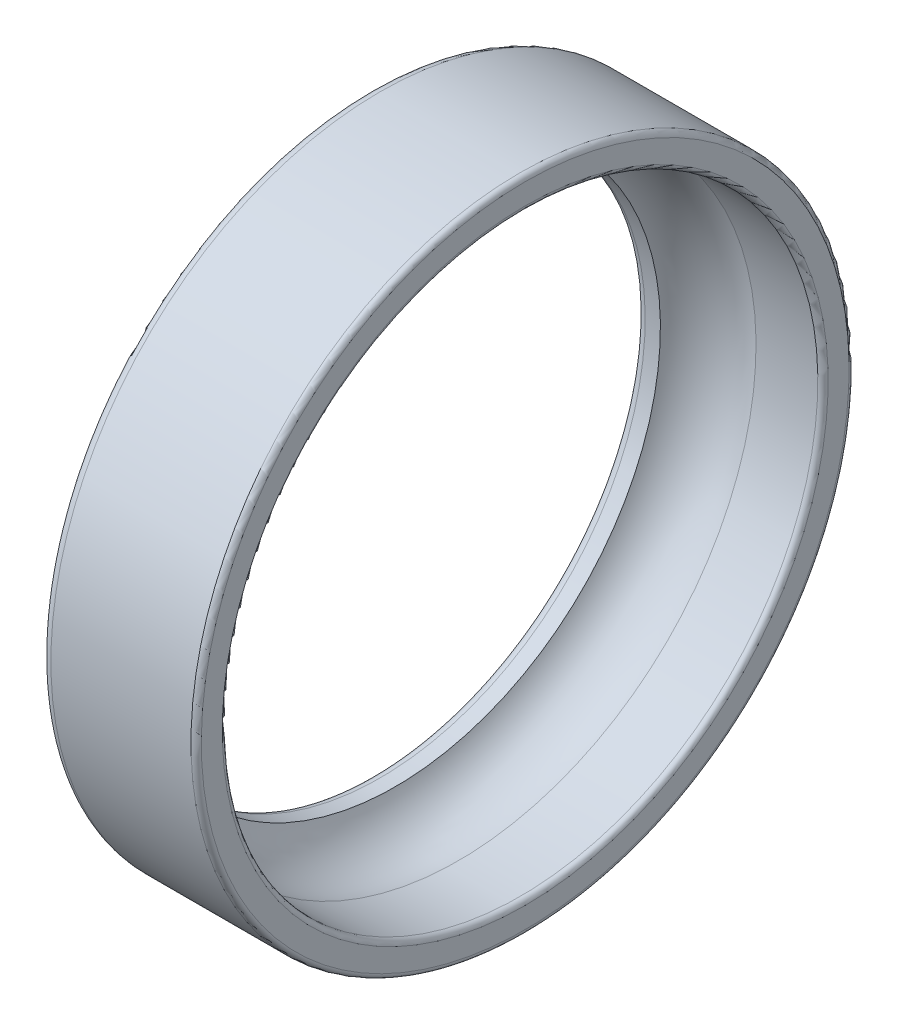
ISO-10303-21;
HEADER;
FILE_DESCRIPTION(('STEP AP214'),'2;1');
FILE_NAME('part.step','',(''),(''),'','','');
FILE_SCHEMA(('AUTOMOTIVE_DESIGN { 1 0 10303 214 1 1 1 1 }'));
ENDSEC;
DATA;
#1=APPLICATION_CONTEXT('core data for automotive mechanical design processes');
#2=APPLICATION_PROTOCOL_DEFINITION('international standard','automotive_design',2000,#1);
#3=PRODUCT_CONTEXT('',#1,'mechanical');
#4=PRODUCT('Part','Part','',(#3));
#5=PRODUCT_RELATED_PRODUCT_CATEGORY('part','',(#4));
#6=PRODUCT_DEFINITION_FORMATION('','',#4);
#7=PRODUCT_DEFINITION_CONTEXT('part definition',#1,'design');
#8=PRODUCT_DEFINITION('design','',#6,#7);
#9=PRODUCT_DEFINITION_SHAPE('','',#8);
#10=(LENGTH_UNIT() NAMED_UNIT(*) SI_UNIT(.MILLI.,.METRE.));
#11=(NAMED_UNIT(*) PLANE_ANGLE_UNIT() SI_UNIT($,.RADIAN.));
#12=(NAMED_UNIT(*) SI_UNIT($,.STERADIAN.) SOLID_ANGLE_UNIT());
#13=UNCERTAINTY_MEASURE_WITH_UNIT(LENGTH_MEASURE(1.E-05),#10,'distance_accuracy_value','');
#14=(GEOMETRIC_REPRESENTATION_CONTEXT(3) GLOBAL_UNCERTAINTY_ASSIGNED_CONTEXT((#13)) GLOBAL_UNIT_ASSIGNED_CONTEXT((#10,
#11,#12)) REPRESENTATION_CONTEXT('',''));
#15=CARTESIAN_POINT('',(0.,0.,0.));
#16=DIRECTION('',(0.,0.,1.));
#17=DIRECTION('',(1.,0.,0.));
#18=AXIS2_PLACEMENT_3D('',#15,#16,#17);
#19=CARTESIAN_POINT('',(3.71915812802405,0.,0.));
#20=DIRECTION('',(-1.,0.,0.));
#21=DIRECTION('',(0.,1.,0.));
#22=AXIS2_PLACEMENT_3D('',#19,#20,#21);
#23=CYLINDRICAL_SURFACE('',#22,56.425);
#24=CARTESIAN_POINT('',(5.3383162560481,0.,0.));
#25=DIRECTION('',(1.,0.,0.));
#26=DIRECTION('',(0.,1.,0.));
#27=AXIS2_PLACEMENT_3D('',#24,#25,#26);
#28=CIRCLE('',#27,56.425);
#29=CARTESIAN_POINT('',(5.3383162560481,56.425,0.));
#30=VERTEX_POINT('',#29);
#31=EDGE_CURVE('E11',#30,#30,#28,.T.);
#32=ORIENTED_EDGE('',*,*,#31,.T.);
#33=EDGE_LOOP('',(#32));
#34=FACE_BOUND('',#33,.T.);
#35=CARTESIAN_POINT('',(2.1,0.,0.));
#36=DIRECTION('',(1.,0.,0.));
#37=DIRECTION('',(0.,1.,0.));
#38=AXIS2_PLACEMENT_3D('',#35,#36,#37);
#39=CIRCLE('',#38,56.425);
#40=CARTESIAN_POINT('',(2.1,56.425,0.));
#41=VERTEX_POINT('',#40);
#42=EDGE_CURVE('E65',#41,#41,#39,.T.);
#43=ORIENTED_EDGE('',*,*,#42,.F.);
#44=EDGE_LOOP('',(#43));
#45=FACE_BOUND('',#44,.T.);
#46=ADVANCED_FACE('F19',(#34,#45),#23,.F.);
#47=CARTESIAN_POINT('',(16.5,0.,0.));
#48=DIRECTION('',(1.,0.,0.));
#49=DIRECTION('',(0.,0.,-1.));
#50=AXIS2_PLACEMENT_3D('',#47,#48,#49);
#51=TOROIDAL_SURFACE('',#50,51.25,12.303);
#52=CARTESIAN_POINT('',(18.7527281238535,0.,0.));
#53=DIRECTION('',(1.,0.,0.));
#54=DIRECTION('',(0.,1.,0.));
#55=AXIS2_PLACEMENT_3D('',#52,#53,#54);
#56=CIRCLE('',#55,63.345);
#57=CARTESIAN_POINT('',(18.7527281238535,63.345,0.));
#58=VERTEX_POINT('',#57);
#59=EDGE_CURVE('E29',#58,#58,#56,.T.);
#60=ORIENTED_EDGE('',*,*,#59,.T.);
#61=EDGE_LOOP('',(#60));
#62=FACE_BOUND('',#61,.T.);
#63=ORIENTED_EDGE('',*,*,#31,.F.);
#64=EDGE_LOOP('',(#63));
#65=FACE_BOUND('',#64,.T.);
#66=ADVANCED_FACE('F101',(#62,#65),#51,.F.);
#67=CARTESIAN_POINT('',(25.3263640619267,0.,0.));
#68=DIRECTION('',(-1.,0.,0.));
#69=DIRECTION('',(0.,1.,0.));
#70=AXIS2_PLACEMENT_3D('',#67,#68,#69);
#71=CYLINDRICAL_SURFACE('',#70,63.345);
#72=CARTESIAN_POINT('',(31.9,0.,0.));
#73=DIRECTION('',(1.,0.,0.));
#74=DIRECTION('',(0.,1.,0.));
#75=AXIS2_PLACEMENT_3D('',#72,#73,#74);
#76=CIRCLE('',#75,63.345);
#77=CARTESIAN_POINT('',(31.9,63.345,0.));
#78=VERTEX_POINT('',#77);
#79=EDGE_CURVE('E79',#78,#78,#76,.T.);
#80=ORIENTED_EDGE('',*,*,#79,.T.);
#81=EDGE_LOOP('',(#80));
#82=FACE_BOUND('',#81,.T.);
#83=ORIENTED_EDGE('',*,*,#59,.F.);
#84=EDGE_LOOP('',(#83));
#85=FACE_BOUND('',#84,.T.);
#86=ADVANCED_FACE('F97',(#82,#85),#71,.F.);
#87=CARTESIAN_POINT('',(31.9,0.,0.));
#88=DIRECTION('',(1.,0.,0.));
#89=DIRECTION('',(0.,0.,-1.));
#90=AXIS2_PLACEMENT_3D('',#87,#88,#89);
#91=TOROIDAL_SURFACE('',#90,64.445,1.1);
#92=CARTESIAN_POINT('',(33.,0.,0.));
#93=DIRECTION('',(1.,0.,0.));
#94=DIRECTION('',(0.,1.,0.));
#95=AXIS2_PLACEMENT_3D('',#92,#93,#94);
#96=CIRCLE('',#95,64.445);
#97=CARTESIAN_POINT('',(33.,64.445,0.));
#98=VERTEX_POINT('',#97);
#99=EDGE_CURVE('E76',#98,#98,#96,.T.);
#100=ORIENTED_EDGE('',*,*,#99,.T.);
#101=EDGE_LOOP('',(#100));
#102=FACE_BOUND('',#101,.T.);
#103=ORIENTED_EDGE('',*,*,#79,.F.);
#104=EDGE_LOOP('',(#103));
#105=FACE_BOUND('',#104,.T.);
#106=ADVANCED_FACE('F84',(#102,#105),#91,.T.);
#107=CARTESIAN_POINT('',(33.,66.6725,0.));
#108=DIRECTION('',(1.,0.,0.));
#109=DIRECTION('',(0.,1.,0.));
#110=AXIS2_PLACEMENT_3D('',#107,#108,#109);
#111=PLANE('',#110);
#112=CARTESIAN_POINT('',(33.,0.,0.));
#113=DIRECTION('',(1.,0.,0.));
#114=DIRECTION('',(0.,1.,0.));
#115=AXIS2_PLACEMENT_3D('',#112,#113,#114);
#116=CIRCLE('',#115,68.9);
#117=CARTESIAN_POINT('',(33.,68.9,0.));
#118=VERTEX_POINT('',#117);
#119=EDGE_CURVE('E23',#118,#118,#116,.T.);
#120=ORIENTED_EDGE('',*,*,#119,.T.);
#121=EDGE_LOOP('',(#120));
#122=FACE_BOUND('',#121,.T.);
#123=ORIENTED_EDGE('',*,*,#99,.F.);
#124=EDGE_LOOP('',(#123));
#125=FACE_BOUND('',#124,.T.);
#126=ADVANCED_FACE('F87',(#122,#125),#111,.T.);
#127=CARTESIAN_POINT('',(31.9,0.,0.));
#128=DIRECTION('',(1.,0.,0.));
#129=DIRECTION('',(0.,0.,-1.));
#130=AXIS2_PLACEMENT_3D('',#127,#128,#129);
#131=TOROIDAL_SURFACE('',#130,68.9,1.1);
#132=CARTESIAN_POINT('',(31.9,0.,0.));
#133=DIRECTION('',(1.,0.,0.));
#134=DIRECTION('',(0.,1.,0.));
#135=AXIS2_PLACEMENT_3D('',#132,#133,#134);
#136=CIRCLE('',#135,70.);
#137=CARTESIAN_POINT('',(31.9,70.,0.));
#138=VERTEX_POINT('',#137);
#139=EDGE_CURVE('E52',#138,#138,#136,.T.);
#140=ORIENTED_EDGE('',*,*,#139,.T.);
#141=EDGE_LOOP('',(#140));
#142=FACE_BOUND('',#141,.T.);
#143=ORIENTED_EDGE('',*,*,#119,.F.);
#144=EDGE_LOOP('',(#143));
#145=FACE_BOUND('',#144,.T.);
#146=ADVANCED_FACE('F89',(#142,#145),#131,.T.);
#147=CARTESIAN_POINT('',(17.,0.,0.));
#148=DIRECTION('',(-1.,0.,0.));
#149=DIRECTION('',(0.,1.,0.));
#150=AXIS2_PLACEMENT_3D('',#147,#148,#149);
#151=CYLINDRICAL_SURFACE('',#150,70.);
#152=CARTESIAN_POINT('',(2.1,0.,0.));
#153=DIRECTION('',(1.,0.,0.));
#154=DIRECTION('',(0.,1.,0.));
#155=AXIS2_PLACEMENT_3D('',#152,#153,#154);
#156=CIRCLE('',#155,70.);
#157=CARTESIAN_POINT('',(2.1,70.,0.));
#158=VERTEX_POINT('',#157);
#159=EDGE_CURVE('E72',#158,#158,#156,.T.);
#160=ORIENTED_EDGE('',*,*,#159,.T.);
#161=EDGE_LOOP('',(#160));
#162=FACE_BOUND('',#161,.T.);
#163=ORIENTED_EDGE('',*,*,#139,.F.);
#164=EDGE_LOOP('',(#163));
#165=FACE_BOUND('',#164,.T.);
#166=ADVANCED_FACE('F21',(#162,#165),#151,.T.);
#167=CARTESIAN_POINT('',(2.1,0.,0.));
#168=DIRECTION('',(1.,0.,0.));
#169=DIRECTION('',(0.,0.,-1.));
#170=AXIS2_PLACEMENT_3D('',#167,#168,#169);
#171=TOROIDAL_SURFACE('',#170,67.9,2.1);
#172=CARTESIAN_POINT('',(0.,0.,0.));
#173=DIRECTION('',(1.,0.,0.));
#174=DIRECTION('',(0.,1.,0.));
#175=AXIS2_PLACEMENT_3D('',#172,#173,#174);
#176=CIRCLE('',#175,67.9);
#177=CARTESIAN_POINT('',(0.,67.9,0.));
#178=VERTEX_POINT('',#177);
#179=EDGE_CURVE('E69',#178,#178,#176,.T.);
#180=ORIENTED_EDGE('',*,*,#179,.T.);
#181=EDGE_LOOP('',(#180));
#182=FACE_BOUND('',#181,.T.);
#183=ORIENTED_EDGE('',*,*,#159,.F.);
#184=EDGE_LOOP('',(#183));
#185=FACE_BOUND('',#184,.T.);
#186=ADVANCED_FACE('F110',(#182,#185),#171,.T.);
#187=CARTESIAN_POINT('',(0.,63.2125,0.));
#188=DIRECTION('',(-1.,0.,0.));
#189=DIRECTION('',(0.,-1.,0.));
#190=AXIS2_PLACEMENT_3D('',#187,#188,#189);
#191=PLANE('',#190);
#192=CARTESIAN_POINT('',(0.,0.,0.));
#193=DIRECTION('',(1.,0.,0.));
#194=DIRECTION('',(0.,1.,0.));
#195=AXIS2_PLACEMENT_3D('',#192,#193,#194);
#196=CIRCLE('',#195,58.525);
#197=CARTESIAN_POINT('',(0.,58.525,0.));
#198=VERTEX_POINT('',#197);
#199=EDGE_CURVE('E70',#198,#198,#196,.T.);
#200=ORIENTED_EDGE('',*,*,#199,.T.);
#201=EDGE_LOOP('',(#200));
#202=FACE_BOUND('',#201,.T.);
#203=ORIENTED_EDGE('',*,*,#179,.F.);
#204=EDGE_LOOP('',(#203));
#205=FACE_BOUND('',#204,.T.);
#206=ADVANCED_FACE('F108',(#202,#205),#191,.T.);
#207=CARTESIAN_POINT('',(2.1,0.,0.));
#208=DIRECTION('',(1.,0.,0.));
#209=DIRECTION('',(0.,0.,-1.));
#210=AXIS2_PLACEMENT_3D('',#207,#208,#209);
#211=TOROIDAL_SURFACE('',#210,58.525,2.1);
#212=ORIENTED_EDGE('',*,*,#42,.T.);
#213=EDGE_LOOP('',(#212));
#214=FACE_BOUND('',#213,.T.);
#215=ORIENTED_EDGE('',*,*,#199,.F.);
#216=EDGE_LOOP('',(#215));
#217=FACE_BOUND('',#216,.T.);
#218=ADVANCED_FACE('F66',(#214,#217),#211,.T.);
#219=CLOSED_SHELL('',(#46,#66,#86,#106,#126,#146,#166,#186,#206,#218));
#220=MANIFOLD_SOLID_BREP('B1',#219);
#221=ADVANCED_BREP_SHAPE_REPRESENTATION('',(#18,#220),#14);
#222=SHAPE_DEFINITION_REPRESENTATION(#9,#221);
ENDSEC;
END-ISO-10303-21;
